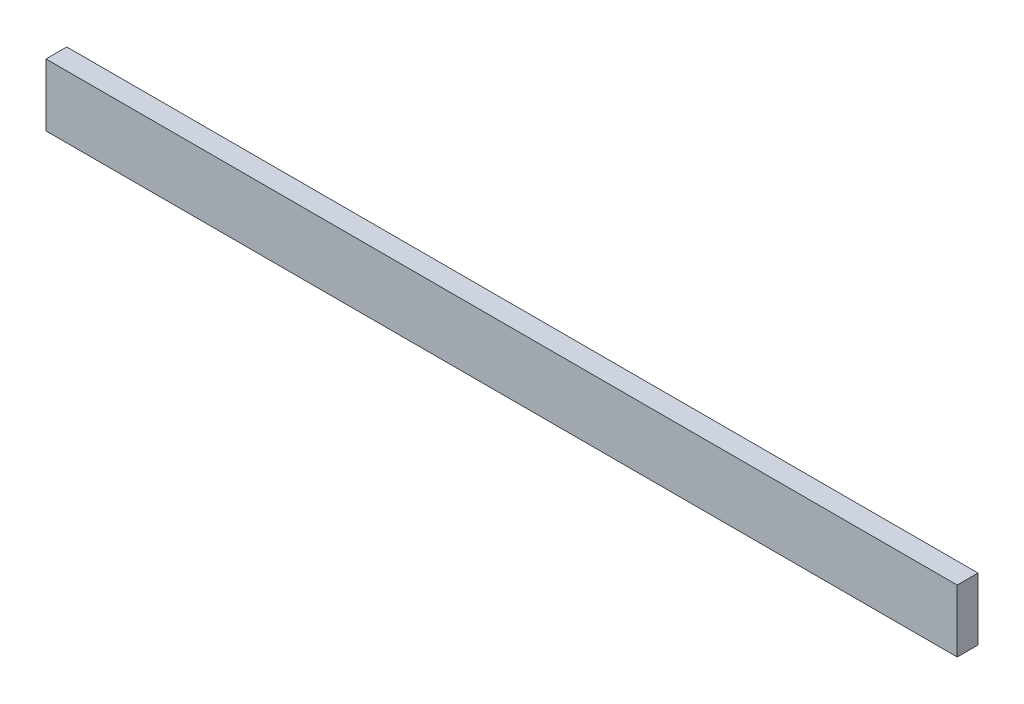
ISO-10303-21;
HEADER;
FILE_DESCRIPTION(('STEP AP214'),'2;1');
FILE_NAME('part.step','',(''),(''),'','','');
FILE_SCHEMA(('AUTOMOTIVE_DESIGN { 1 0 10303 214 1 1 1 1 }'));
ENDSEC;
DATA;
#1=APPLICATION_CONTEXT('core data for automotive mechanical design processes');
#2=APPLICATION_PROTOCOL_DEFINITION('international standard','automotive_design',2000,#1);
#3=PRODUCT_CONTEXT('',#1,'mechanical');
#4=PRODUCT('Part','Part','',(#3));
#5=PRODUCT_RELATED_PRODUCT_CATEGORY('part','',(#4));
#6=PRODUCT_DEFINITION_FORMATION('','',#4);
#7=PRODUCT_DEFINITION_CONTEXT('part definition',#1,'design');
#8=PRODUCT_DEFINITION('design','',#6,#7);
#9=PRODUCT_DEFINITION_SHAPE('','',#8);
#10=(LENGTH_UNIT() NAMED_UNIT(*) SI_UNIT(.MILLI.,.METRE.));
#11=(NAMED_UNIT(*) PLANE_ANGLE_UNIT() SI_UNIT($,.RADIAN.));
#12=(NAMED_UNIT(*) SI_UNIT($,.STERADIAN.) SOLID_ANGLE_UNIT());
#13=UNCERTAINTY_MEASURE_WITH_UNIT(LENGTH_MEASURE(1.E-05),#10,'distance_accuracy_value','');
#14=(GEOMETRIC_REPRESENTATION_CONTEXT(3) GLOBAL_UNCERTAINTY_ASSIGNED_CONTEXT((#13)) GLOBAL_UNIT_ASSIGNED_CONTEXT((#10,
#11,#12)) REPRESENTATION_CONTEXT('',''));
#15=CARTESIAN_POINT('',(0.,0.,0.));
#16=DIRECTION('',(0.,0.,1.));
#17=DIRECTION('',(1.,0.,0.));
#18=AXIS2_PLACEMENT_3D('',#15,#16,#17);
#19=CARTESIAN_POINT('',(0.,0.,6.35));
#20=DIRECTION('',(1.,0.,0.));
#21=DIRECTION('',(0.,0.,-1.));
#22=AXIS2_PLACEMENT_3D('',#19,#20,#21);
#23=PLANE('',#22);
#24=DIRECTION('',(0.,-1.,0.));
#25=VECTOR('',#24,1.);
#26=CARTESIAN_POINT('',(0.,0.,0.));
#27=LINE('',#26,#25);
#28=CARTESIAN_POINT('',(0.,19.05,0.));
#29=VERTEX_POINT('',#28);
#30=CARTESIAN_POINT('',(0.,0.,0.));
#31=VERTEX_POINT('',#30);
#32=EDGE_CURVE('E96',#29,#31,#27,.T.);
#33=ORIENTED_EDGE('',*,*,#32,.T.);
#34=DIRECTION('',(0.,0.,-1.));
#35=VECTOR('',#34,1.);
#36=CARTESIAN_POINT('',(0.,0.,6.35));
#37=LINE('',#36,#35);
#38=CARTESIAN_POINT('',(0.,0.,6.35));
#39=VERTEX_POINT('',#38);
#40=EDGE_CURVE('E11',#39,#31,#37,.T.);
#41=ORIENTED_EDGE('',*,*,#40,.F.);
#42=DIRECTION('',(0.,-1.,0.));
#43=VECTOR('',#42,1.);
#44=CARTESIAN_POINT('',(0.,0.,6.35));
#45=LINE('',#44,#43);
#46=CARTESIAN_POINT('',(0.,19.05,6.35));
#47=VERTEX_POINT('',#46);
#48=EDGE_CURVE('E84',#47,#39,#45,.T.);
#49=ORIENTED_EDGE('',*,*,#48,.F.);
#50=DIRECTION('',(0.,0.,-1.));
#51=VECTOR('',#50,1.);
#52=CARTESIAN_POINT('',(0.,19.05,6.35));
#53=LINE('',#52,#51);
#54=EDGE_CURVE('E92',#47,#29,#53,.T.);
#55=ORIENTED_EDGE('',*,*,#54,.T.);
#56=EDGE_LOOP('',(#33,#41,#49,#55));
#57=FACE_BOUND('',#56,.T.);
#58=ADVANCED_FACE('F33',(#57),#23,.F.);
#59=CARTESIAN_POINT('',(0.,0.,6.35));
#60=DIRECTION('',(0.,1.,0.));
#61=DIRECTION('',(0.,0.,1.));
#62=AXIS2_PLACEMENT_3D('',#59,#60,#61);
#63=PLANE('',#62);
#64=DIRECTION('',(1.,0.,0.));
#65=VECTOR('',#64,1.);
#66=CARTESIAN_POINT('',(0.,0.,0.));
#67=LINE('',#66,#65);
#68=CARTESIAN_POINT('',(278.384,0.,0.));
#69=VERTEX_POINT('',#68);
#70=EDGE_CURVE('E88',#31,#69,#67,.T.);
#71=ORIENTED_EDGE('',*,*,#70,.T.);
#72=DIRECTION('',(0.,0.,-1.));
#73=VECTOR('',#72,1.);
#74=CARTESIAN_POINT('',(278.384,0.,6.35));
#75=LINE('',#74,#73);
#76=CARTESIAN_POINT('',(278.384,0.,6.35));
#77=VERTEX_POINT('',#76);
#78=EDGE_CURVE('E41',#77,#69,#75,.T.);
#79=ORIENTED_EDGE('',*,*,#78,.F.);
#80=DIRECTION('',(1.,0.,0.));
#81=VECTOR('',#80,1.);
#82=CARTESIAN_POINT('',(0.,0.,6.35));
#83=LINE('',#82,#81);
#84=EDGE_CURVE('E79',#39,#77,#83,.T.);
#85=ORIENTED_EDGE('',*,*,#84,.F.);
#86=ORIENTED_EDGE('',*,*,#40,.T.);
#87=EDGE_LOOP('',(#71,#79,#85,#86));
#88=FACE_BOUND('',#87,.T.);
#89=ADVANCED_FACE('F87',(#88),#63,.F.);
#90=CARTESIAN_POINT('',(278.384,0.,6.35));
#91=DIRECTION('',(-1.,0.,0.));
#92=DIRECTION('',(0.,0.,1.));
#93=AXIS2_PLACEMENT_3D('',#90,#91,#92);
#94=PLANE('',#93);
#95=DIRECTION('',(0.,1.,0.));
#96=VECTOR('',#95,1.);
#97=CARTESIAN_POINT('',(278.384,0.,0.));
#98=LINE('',#97,#96);
#99=CARTESIAN_POINT('',(278.384,19.05,0.));
#100=VERTEX_POINT('',#99);
#101=EDGE_CURVE('E66',#69,#100,#98,.T.);
#102=ORIENTED_EDGE('',*,*,#101,.T.);
#103=DIRECTION('',(0.,0.,-1.));
#104=VECTOR('',#103,1.);
#105=CARTESIAN_POINT('',(278.384,19.05,6.35));
#106=LINE('',#105,#104);
#107=CARTESIAN_POINT('',(278.384,19.05,6.35));
#108=VERTEX_POINT('',#107);
#109=EDGE_CURVE('E89',#108,#100,#106,.T.);
#110=ORIENTED_EDGE('',*,*,#109,.F.);
#111=DIRECTION('',(0.,1.,0.));
#112=VECTOR('',#111,1.);
#113=CARTESIAN_POINT('',(278.384,0.,6.35));
#114=LINE('',#113,#112);
#115=EDGE_CURVE('E82',#77,#108,#114,.T.);
#116=ORIENTED_EDGE('',*,*,#115,.F.);
#117=ORIENTED_EDGE('',*,*,#78,.T.);
#118=EDGE_LOOP('',(#102,#110,#116,#117));
#119=FACE_BOUND('',#118,.T.);
#120=ADVANCED_FACE('F90',(#119),#94,.F.);
#121=CARTESIAN_POINT('',(0.,19.05,6.35));
#122=DIRECTION('',(0.,-1.,0.));
#123=DIRECTION('',(0.,0.,-1.));
#124=AXIS2_PLACEMENT_3D('',#121,#122,#123);
#125=PLANE('',#124);
#126=DIRECTION('',(-1.,0.,0.));
#127=VECTOR('',#126,1.);
#128=CARTESIAN_POINT('',(0.,19.05,0.));
#129=LINE('',#128,#127);
#130=EDGE_CURVE('E72',#100,#29,#129,.T.);
#131=ORIENTED_EDGE('',*,*,#130,.T.);
#132=ORIENTED_EDGE('',*,*,#54,.F.);
#133=DIRECTION('',(-1.,0.,0.));
#134=VECTOR('',#133,1.);
#135=CARTESIAN_POINT('',(0.,19.05,6.35));
#136=LINE('',#135,#134);
#137=EDGE_CURVE('E49',#108,#47,#136,.T.);
#138=ORIENTED_EDGE('',*,*,#137,.F.);
#139=ORIENTED_EDGE('',*,*,#109,.T.);
#140=EDGE_LOOP('',(#131,#132,#138,#139));
#141=FACE_BOUND('',#140,.T.);
#142=ADVANCED_FACE('F103',(#141),#125,.F.);
#143=CARTESIAN_POINT('',(0.,0.,6.35));
#144=DIRECTION('',(0.,0.,-1.));
#145=DIRECTION('',(-1.,0.,0.));
#146=AXIS2_PLACEMENT_3D('',#143,#144,#145);
#147=PLANE('',#146);
#148=ORIENTED_EDGE('',*,*,#48,.T.);
#149=ORIENTED_EDGE('',*,*,#84,.T.);
#150=ORIENTED_EDGE('',*,*,#115,.T.);
#151=ORIENTED_EDGE('',*,*,#137,.T.);
#152=EDGE_LOOP('',(#148,#149,#150,#151));
#153=FACE_BOUND('',#152,.T.);
#154=ADVANCED_FACE('F80',(#153),#147,.F.);
#155=CARTESIAN_POINT('',(0.,0.,0.));
#156=DIRECTION('',(0.,0.,-1.));
#157=DIRECTION('',(-1.,0.,0.));
#158=AXIS2_PLACEMENT_3D('',#155,#156,#157);
#159=PLANE('',#158);
#160=ORIENTED_EDGE('',*,*,#32,.F.);
#161=ORIENTED_EDGE('',*,*,#130,.F.);
#162=ORIENTED_EDGE('',*,*,#101,.F.);
#163=ORIENTED_EDGE('',*,*,#70,.F.);
#164=EDGE_LOOP('',(#160,#161,#162,#163));
#165=FACE_BOUND('',#164,.T.);
#166=ADVANCED_FACE('F106',(#165),#159,.T.);
#167=CLOSED_SHELL('',(#58,#89,#120,#142,#154,#166));
#168=MANIFOLD_SOLID_BREP('B2',#167);
#169=ADVANCED_BREP_SHAPE_REPRESENTATION('',(#18,#168),#14);
#170=SHAPE_DEFINITION_REPRESENTATION(#9,#169);
ENDSEC;
END-ISO-10303-21;
